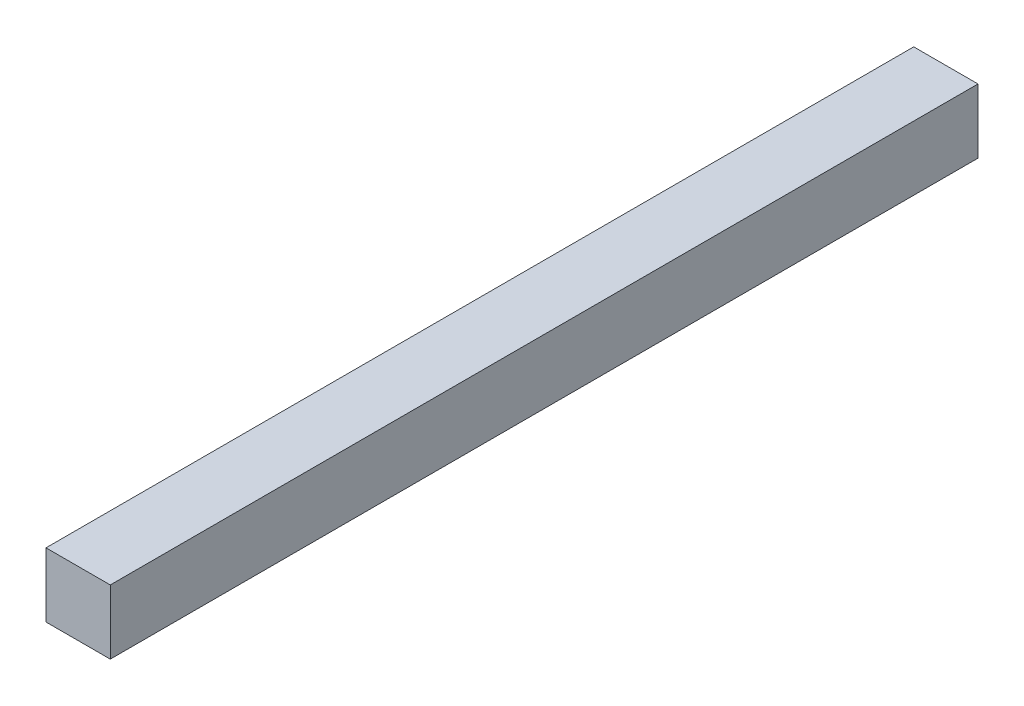
ISO-10303-21;
HEADER;
FILE_DESCRIPTION(('STEP AP214'),'2;1');
FILE_NAME('part.step','',(''),(''),'','','');
FILE_SCHEMA(('AUTOMOTIVE_DESIGN { 1 0 10303 214 1 1 1 1 }'));
ENDSEC;
DATA;
#1=APPLICATION_CONTEXT('core data for automotive mechanical design processes');
#2=APPLICATION_PROTOCOL_DEFINITION('international standard','automotive_design',2000,#1);
#3=PRODUCT_CONTEXT('',#1,'mechanical');
#4=PRODUCT('Part','Part','',(#3));
#5=PRODUCT_RELATED_PRODUCT_CATEGORY('part','',(#4));
#6=PRODUCT_DEFINITION_FORMATION('','',#4);
#7=PRODUCT_DEFINITION_CONTEXT('part definition',#1,'design');
#8=PRODUCT_DEFINITION('design','',#6,#7);
#9=PRODUCT_DEFINITION_SHAPE('','',#8);
#10=(LENGTH_UNIT() NAMED_UNIT(*) SI_UNIT(.MILLI.,.METRE.));
#11=(NAMED_UNIT(*) PLANE_ANGLE_UNIT() SI_UNIT($,.RADIAN.));
#12=(NAMED_UNIT(*) SI_UNIT($,.STERADIAN.) SOLID_ANGLE_UNIT());
#13=UNCERTAINTY_MEASURE_WITH_UNIT(LENGTH_MEASURE(1.E-05),#10,'distance_accuracy_value','');
#14=(GEOMETRIC_REPRESENTATION_CONTEXT(3) GLOBAL_UNCERTAINTY_ASSIGNED_CONTEXT((#13)) GLOBAL_UNIT_ASSIGNED_CONTEXT((#10,
#11,#12)) REPRESENTATION_CONTEXT('',''));
#15=CARTESIAN_POINT('',(0.,0.,0.));
#16=DIRECTION('',(0.,0.,1.));
#17=DIRECTION('',(1.,0.,0.));
#18=AXIS2_PLACEMENT_3D('',#15,#16,#17);
#19=CARTESIAN_POINT('',(0.,0.,34.29));
#20=DIRECTION('',(-1.,0.,0.));
#21=DIRECTION('',(0.,-1.,0.));
#22=AXIS2_PLACEMENT_3D('',#19,#20,#21);
#23=PLANE('',#22);
#24=DIRECTION('',(0.,1.,0.));
#25=VECTOR('',#24,1.);
#26=CARTESIAN_POINT('',(0.,0.,0.));
#27=LINE('',#26,#25);
#28=CARTESIAN_POINT('',(0.,0.,0.));
#29=VERTEX_POINT('',#28);
#30=CARTESIAN_POINT('',(0.,2.54,0.));
#31=VERTEX_POINT('',#30);
#32=EDGE_CURVE('E99',#29,#31,#27,.T.);
#33=ORIENTED_EDGE('',*,*,#32,.T.);
#34=DIRECTION('',(0.,0.,-1.));
#35=VECTOR('',#34,1.);
#36=CARTESIAN_POINT('',(0.,2.54,34.29));
#37=LINE('',#36,#35);
#38=CARTESIAN_POINT('',(0.,2.54,34.29));
#39=VERTEX_POINT('',#38);
#40=EDGE_CURVE('E11',#39,#31,#37,.T.);
#41=ORIENTED_EDGE('',*,*,#40,.F.);
#42=DIRECTION('',(0.,1.,0.));
#43=VECTOR('',#42,1.);
#44=CARTESIAN_POINT('',(0.,0.,34.29));
#45=LINE('',#44,#43);
#46=CARTESIAN_POINT('',(0.,0.,34.29));
#47=VERTEX_POINT('',#46);
#48=EDGE_CURVE('E87',#47,#39,#45,.T.);
#49=ORIENTED_EDGE('',*,*,#48,.F.);
#50=DIRECTION('',(0.,0.,-1.));
#51=VECTOR('',#50,1.);
#52=CARTESIAN_POINT('',(0.,0.,34.29));
#53=LINE('',#52,#51);
#54=EDGE_CURVE('E95',#47,#29,#53,.T.);
#55=ORIENTED_EDGE('',*,*,#54,.T.);
#56=EDGE_LOOP('',(#33,#41,#49,#55));
#57=FACE_BOUND('',#56,.T.);
#58=ADVANCED_FACE('F36',(#57),#23,.F.);
#59=CARTESIAN_POINT('',(0.,2.54,34.29));
#60=DIRECTION('',(0.,-1.,0.));
#61=DIRECTION('',(0.,0.,-1.));
#62=AXIS2_PLACEMENT_3D('',#59,#60,#61);
#63=PLANE('',#62);
#64=DIRECTION('',(-1.,0.,0.));
#65=VECTOR('',#64,1.);
#66=CARTESIAN_POINT('',(0.,2.54,0.));
#67=LINE('',#66,#65);
#68=CARTESIAN_POINT('',(-2.54,2.54,0.));
#69=VERTEX_POINT('',#68);
#70=EDGE_CURVE('E91',#31,#69,#67,.T.);
#71=ORIENTED_EDGE('',*,*,#70,.T.);
#72=DIRECTION('',(0.,0.,-1.));
#73=VECTOR('',#72,1.);
#74=CARTESIAN_POINT('',(-2.54,2.54,34.29));
#75=LINE('',#74,#73);
#76=CARTESIAN_POINT('',(-2.54,2.54,34.29));
#77=VERTEX_POINT('',#76);
#78=EDGE_CURVE('E44',#77,#69,#75,.T.);
#79=ORIENTED_EDGE('',*,*,#78,.F.);
#80=DIRECTION('',(-1.,0.,0.));
#81=VECTOR('',#80,1.);
#82=CARTESIAN_POINT('',(0.,2.54,34.29));
#83=LINE('',#82,#81);
#84=EDGE_CURVE('E82',#39,#77,#83,.T.);
#85=ORIENTED_EDGE('',*,*,#84,.F.);
#86=ORIENTED_EDGE('',*,*,#40,.T.);
#87=EDGE_LOOP('',(#71,#79,#85,#86));
#88=FACE_BOUND('',#87,.T.);
#89=ADVANCED_FACE('F90',(#88),#63,.F.);
#90=CARTESIAN_POINT('',(-2.54,0.,34.29));
#91=DIRECTION('',(1.,0.,0.));
#92=DIRECTION('',(0.,0.,-1.));
#93=AXIS2_PLACEMENT_3D('',#90,#91,#92);
#94=PLANE('',#93);
#95=DIRECTION('',(0.,-1.,0.));
#96=VECTOR('',#95,1.);
#97=CARTESIAN_POINT('',(-2.54,0.,0.));
#98=LINE('',#97,#96);
#99=CARTESIAN_POINT('',(-2.54,0.,0.));
#100=VERTEX_POINT('',#99);
#101=EDGE_CURVE('E69',#69,#100,#98,.T.);
#102=ORIENTED_EDGE('',*,*,#101,.T.);
#103=DIRECTION('',(0.,0.,-1.));
#104=VECTOR('',#103,1.);
#105=CARTESIAN_POINT('',(-2.54,0.,34.29));
#106=LINE('',#105,#104);
#107=CARTESIAN_POINT('',(-2.54,0.,34.29));
#108=VERTEX_POINT('',#107);
#109=EDGE_CURVE('E92',#108,#100,#106,.T.);
#110=ORIENTED_EDGE('',*,*,#109,.F.);
#111=DIRECTION('',(0.,-1.,0.));
#112=VECTOR('',#111,1.);
#113=CARTESIAN_POINT('',(-2.54,0.,34.29));
#114=LINE('',#113,#112);
#115=EDGE_CURVE('E85',#77,#108,#114,.T.);
#116=ORIENTED_EDGE('',*,*,#115,.F.);
#117=ORIENTED_EDGE('',*,*,#78,.T.);
#118=EDGE_LOOP('',(#102,#110,#116,#117));
#119=FACE_BOUND('',#118,.T.);
#120=ADVANCED_FACE('F93',(#119),#94,.F.);
#121=CARTESIAN_POINT('',(0.,0.,34.29));
#122=DIRECTION('',(0.,1.,0.));
#123=DIRECTION('',(-1.,0.,0.));
#124=AXIS2_PLACEMENT_3D('',#121,#122,#123);
#125=PLANE('',#124);
#126=DIRECTION('',(1.,0.,0.));
#127=VECTOR('',#126,1.);
#128=CARTESIAN_POINT('',(0.,0.,0.));
#129=LINE('',#128,#127);
#130=EDGE_CURVE('E75',#100,#29,#129,.T.);
#131=ORIENTED_EDGE('',*,*,#130,.T.);
#132=ORIENTED_EDGE('',*,*,#54,.F.);
#133=DIRECTION('',(1.,0.,0.));
#134=VECTOR('',#133,1.);
#135=CARTESIAN_POINT('',(0.,0.,34.29));
#136=LINE('',#135,#134);
#137=EDGE_CURVE('E52',#108,#47,#136,.T.);
#138=ORIENTED_EDGE('',*,*,#137,.F.);
#139=ORIENTED_EDGE('',*,*,#109,.T.);
#140=EDGE_LOOP('',(#131,#132,#138,#139));
#141=FACE_BOUND('',#140,.T.);
#142=ADVANCED_FACE('F106',(#141),#125,.F.);
#143=CARTESIAN_POINT('',(0.,0.,34.29));
#144=DIRECTION('',(0.,0.,1.));
#145=DIRECTION('',(1.,0.,0.));
#146=AXIS2_PLACEMENT_3D('',#143,#144,#145);
#147=PLANE('',#146);
#148=ORIENTED_EDGE('',*,*,#48,.T.);
#149=ORIENTED_EDGE('',*,*,#84,.T.);
#150=ORIENTED_EDGE('',*,*,#115,.T.);
#151=ORIENTED_EDGE('',*,*,#137,.T.);
#152=EDGE_LOOP('',(#148,#149,#150,#151));
#153=FACE_BOUND('',#152,.T.);
#154=ADVANCED_FACE('F83',(#153),#147,.T.);
#155=CARTESIAN_POINT('',(0.,0.,0.));
#156=DIRECTION('',(0.,0.,1.));
#157=DIRECTION('',(1.,0.,0.));
#158=AXIS2_PLACEMENT_3D('',#155,#156,#157);
#159=PLANE('',#158);
#160=ORIENTED_EDGE('',*,*,#32,.F.);
#161=ORIENTED_EDGE('',*,*,#130,.F.);
#162=ORIENTED_EDGE('',*,*,#101,.F.);
#163=ORIENTED_EDGE('',*,*,#70,.F.);
#164=EDGE_LOOP('',(#160,#161,#162,#163));
#165=FACE_BOUND('',#164,.T.);
#166=ADVANCED_FACE('F109',(#165),#159,.F.);
#167=CLOSED_SHELL('',(#58,#89,#120,#142,#154,#166));
#168=MANIFOLD_SOLID_BREP('B2',#167);
#169=ADVANCED_BREP_SHAPE_REPRESENTATION('',(#18,#168),#14);
#170=SHAPE_DEFINITION_REPRESENTATION(#9,#169);
ENDSEC;
END-ISO-10303-21;
